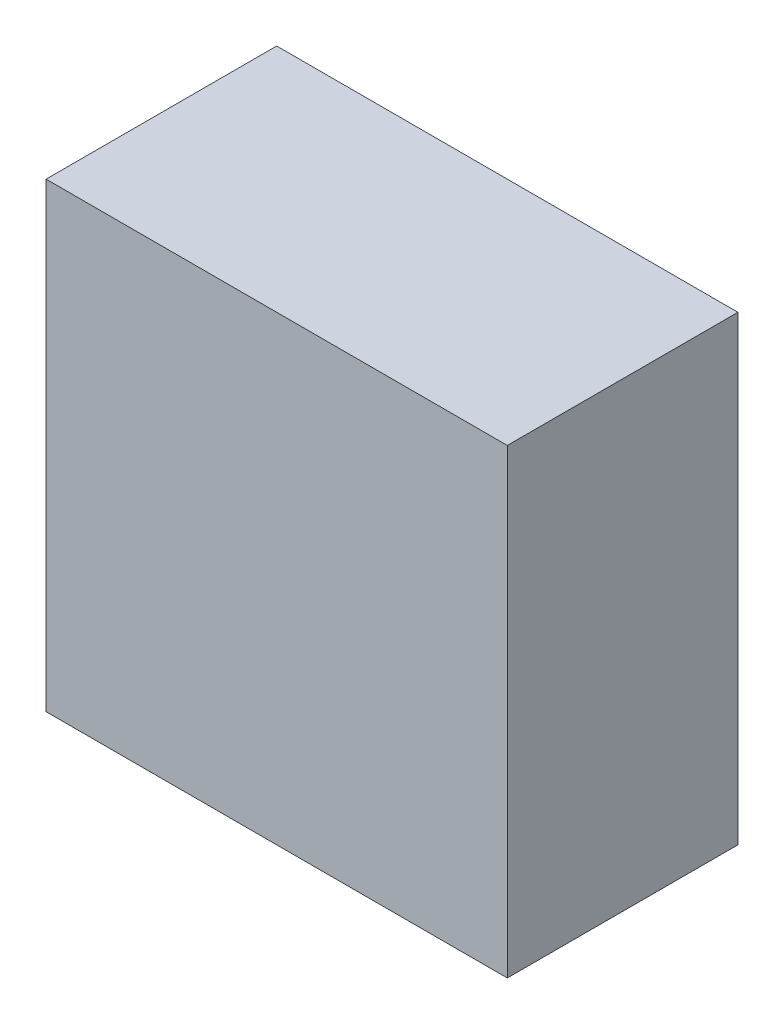
ISO-10303-21;
HEADER;
FILE_DESCRIPTION(('STEP AP214'),'2;1');
FILE_NAME('part.step','',(''),(''),'','','');
FILE_SCHEMA(('AUTOMOTIVE_DESIGN { 1 0 10303 214 1 1 1 1 }'));
ENDSEC;
DATA;
#1=APPLICATION_CONTEXT('core data for automotive mechanical design processes');
#2=APPLICATION_PROTOCOL_DEFINITION('international standard','automotive_design',2000,#1);
#3=PRODUCT_CONTEXT('',#1,'mechanical');
#4=PRODUCT('Part','Part','',(#3));
#5=PRODUCT_RELATED_PRODUCT_CATEGORY('part','',(#4));
#6=PRODUCT_DEFINITION_FORMATION('','',#4);
#7=PRODUCT_DEFINITION_CONTEXT('part definition',#1,'design');
#8=PRODUCT_DEFINITION('design','',#6,#7);
#9=PRODUCT_DEFINITION_SHAPE('','',#8);
#10=(LENGTH_UNIT() NAMED_UNIT(*) SI_UNIT(.MILLI.,.METRE.));
#11=(NAMED_UNIT(*) PLANE_ANGLE_UNIT() SI_UNIT($,.RADIAN.));
#12=(NAMED_UNIT(*) SI_UNIT($,.STERADIAN.) SOLID_ANGLE_UNIT());
#13=UNCERTAINTY_MEASURE_WITH_UNIT(LENGTH_MEASURE(1.E-05),#10,'distance_accuracy_value','');
#14=(GEOMETRIC_REPRESENTATION_CONTEXT(3) GLOBAL_UNCERTAINTY_ASSIGNED_CONTEXT((#13)) GLOBAL_UNIT_ASSIGNED_CONTEXT((#10,
#11,#12)) REPRESENTATION_CONTEXT('',''));
#15=CARTESIAN_POINT('',(0.,0.,0.));
#16=DIRECTION('',(0.,0.,1.));
#17=DIRECTION('',(1.,0.,0.));
#18=AXIS2_PLACEMENT_3D('',#15,#16,#17);
#19=CARTESIAN_POINT('',(10.,-10.,10.));
#20=DIRECTION('',(-1.,0.,0.));
#21=DIRECTION('',(0.,0.,1.));
#22=AXIS2_PLACEMENT_3D('',#19,#20,#21);
#23=PLANE('',#22);
#24=DIRECTION('',(0.,1.,0.));
#25=VECTOR('',#24,1.);
#26=CARTESIAN_POINT('',(10.,-10.,0.));
#27=LINE('',#26,#25);
#28=CARTESIAN_POINT('',(10.,-10.,0.));
#29=VERTEX_POINT('',#28);
#30=CARTESIAN_POINT('',(10.,10.,0.));
#31=VERTEX_POINT('',#30);
#32=EDGE_CURVE('E299',#29,#31,#27,.T.);
#33=ORIENTED_EDGE('',*,*,#32,.T.);
#34=DIRECTION('',(0.,0.,-1.));
#35=VECTOR('',#34,1.);
#36=CARTESIAN_POINT('',(10.,10.,10.));
#37=LINE('',#36,#35);
#38=CARTESIAN_POINT('',(10.,10.,10.));
#39=VERTEX_POINT('',#38);
#40=EDGE_CURVE('E40',#39,#31,#37,.T.);
#41=ORIENTED_EDGE('',*,*,#40,.F.);
#42=DIRECTION('',(0.,1.,0.));
#43=VECTOR('',#42,1.);
#44=CARTESIAN_POINT('',(10.,-10.,10.));
#45=LINE('',#44,#43);
#46=CARTESIAN_POINT('',(10.,-10.,10.));
#47=VERTEX_POINT('',#46);
#48=EDGE_CURVE('E305',#47,#39,#45,.T.);
#49=ORIENTED_EDGE('',*,*,#48,.F.);
#50=DIRECTION('',(0.,0.,-1.));
#51=VECTOR('',#50,1.);
#52=CARTESIAN_POINT('',(10.,-10.,10.));
#53=LINE('',#52,#51);
#54=EDGE_CURVE('E315',#47,#29,#53,.T.);
#55=ORIENTED_EDGE('',*,*,#54,.T.);
#56=EDGE_LOOP('',(#33,#41,#49,#55));
#57=FACE_BOUND('',#56,.T.);
#58=ADVANCED_FACE('F33',(#57),#23,.F.);
#59=CARTESIAN_POINT('',(-10.,10.,10.));
#60=DIRECTION('',(0.,-1.,0.));
#61=DIRECTION('',(0.,0.,-1.));
#62=AXIS2_PLACEMENT_3D('',#59,#60,#61);
#63=PLANE('',#62);
#64=DIRECTION('',(-1.,0.,0.));
#65=VECTOR('',#64,1.);
#66=CARTESIAN_POINT('',(-10.,10.,0.));
#67=LINE('',#66,#65);
#68=CARTESIAN_POINT('',(-10.,10.,0.));
#69=VERTEX_POINT('',#68);
#70=EDGE_CURVE('E318',#31,#69,#67,.T.);
#71=ORIENTED_EDGE('',*,*,#70,.T.);
#72=DIRECTION('',(0.,0.,-1.));
#73=VECTOR('',#72,1.);
#74=CARTESIAN_POINT('',(-10.,10.,10.));
#75=LINE('',#74,#73);
#76=CARTESIAN_POINT('',(-10.,10.,10.));
#77=VERTEX_POINT('',#76);
#78=EDGE_CURVE('E328',#77,#69,#75,.T.);
#79=ORIENTED_EDGE('',*,*,#78,.F.);
#80=DIRECTION('',(-1.,0.,0.));
#81=VECTOR('',#80,1.);
#82=CARTESIAN_POINT('',(-10.,10.,10.));
#83=LINE('',#82,#81);
#84=EDGE_CURVE('E308',#39,#77,#83,.T.);
#85=ORIENTED_EDGE('',*,*,#84,.F.);
#86=ORIENTED_EDGE('',*,*,#40,.T.);
#87=EDGE_LOOP('',(#71,#79,#85,#86));
#88=FACE_BOUND('',#87,.T.);
#89=ADVANCED_FACE('F333',(#88),#63,.F.);
#90=CARTESIAN_POINT('',(-10.,-10.,10.));
#91=DIRECTION('',(1.,0.,0.));
#92=DIRECTION('',(0.,0.,-1.));
#93=AXIS2_PLACEMENT_3D('',#90,#91,#92);
#94=PLANE('',#93);
#95=DIRECTION('',(0.,-1.,0.));
#96=VECTOR('',#95,1.);
#97=CARTESIAN_POINT('',(-10.,-10.,0.));
#98=LINE('',#97,#96);
#99=CARTESIAN_POINT('',(-10.,-10.,0.));
#100=VERTEX_POINT('',#99);
#101=EDGE_CURVE('E320',#69,#100,#98,.T.);
#102=ORIENTED_EDGE('',*,*,#101,.T.);
#103=DIRECTION('',(0.,0.,-1.));
#104=VECTOR('',#103,1.);
#105=CARTESIAN_POINT('',(-10.,-10.,10.));
#106=LINE('',#105,#104);
#107=CARTESIAN_POINT('',(-10.,-10.,10.));
#108=VERTEX_POINT('',#107);
#109=EDGE_CURVE('E325',#108,#100,#106,.T.);
#110=ORIENTED_EDGE('',*,*,#109,.F.);
#111=DIRECTION('',(0.,-1.,0.));
#112=VECTOR('',#111,1.);
#113=CARTESIAN_POINT('',(-10.,-10.,10.));
#114=LINE('',#113,#112);
#115=EDGE_CURVE('E311',#77,#108,#114,.T.);
#116=ORIENTED_EDGE('',*,*,#115,.F.);
#117=ORIENTED_EDGE('',*,*,#78,.T.);
#118=EDGE_LOOP('',(#102,#110,#116,#117));
#119=FACE_BOUND('',#118,.T.);
#120=ADVANCED_FACE('F345',(#119),#94,.F.);
#121=CARTESIAN_POINT('',(-10.,-10.,10.));
#122=DIRECTION('',(0.,1.,0.));
#123=DIRECTION('',(0.,0.,1.));
#124=AXIS2_PLACEMENT_3D('',#121,#122,#123);
#125=PLANE('',#124);
#126=DIRECTION('',(1.,0.,0.));
#127=VECTOR('',#126,1.);
#128=CARTESIAN_POINT('',(-10.,-10.,0.));
#129=LINE('',#128,#127);
#130=EDGE_CURVE('E309',#100,#29,#129,.T.);
#131=ORIENTED_EDGE('',*,*,#130,.T.);
#132=ORIENTED_EDGE('',*,*,#54,.F.);
#133=DIRECTION('',(1.,0.,0.));
#134=VECTOR('',#133,1.);
#135=CARTESIAN_POINT('',(-10.,-10.,10.));
#136=LINE('',#135,#134);
#137=EDGE_CURVE('E313',#108,#47,#136,.T.);
#138=ORIENTED_EDGE('',*,*,#137,.F.);
#139=ORIENTED_EDGE('',*,*,#109,.T.);
#140=EDGE_LOOP('',(#131,#132,#138,#139));
#141=FACE_BOUND('',#140,.T.);
#142=ADVANCED_FACE('F349',(#141),#125,.F.);
#143=CARTESIAN_POINT('',(0.,0.,10.));
#144=DIRECTION('',(0.,0.,-1.));
#145=DIRECTION('',(-1.,0.,0.));
#146=AXIS2_PLACEMENT_3D('',#143,#144,#145);
#147=PLANE('',#146);
#148=ORIENTED_EDGE('',*,*,#48,.T.);
#149=ORIENTED_EDGE('',*,*,#84,.T.);
#150=ORIENTED_EDGE('',*,*,#115,.T.);
#151=ORIENTED_EDGE('',*,*,#137,.T.);
#152=EDGE_LOOP('',(#148,#149,#150,#151));
#153=FACE_BOUND('',#152,.T.);
#154=ADVANCED_FACE('F351',(#153),#147,.F.);
#155=CARTESIAN_POINT('',(0.,0.,0.));
#156=DIRECTION('',(0.,0.,-1.));
#157=DIRECTION('',(-1.,0.,0.));
#158=AXIS2_PLACEMENT_3D('',#155,#156,#157);
#159=PLANE('',#158);
#160=DIRECTION('',(0.,1.,0.));
#161=VECTOR('',#160,1.);
#162=CARTESIAN_POINT('',(-8.5,-8.5,0.));
#163=LINE('',#162,#161);
#164=CARTESIAN_POINT('',(-8.5,-8.5,0.));
#165=VERTEX_POINT('',#164);
#166=CARTESIAN_POINT('',(-8.5,8.5,0.));
#167=VERTEX_POINT('',#166);
#168=EDGE_CURVE('E55',#165,#167,#163,.T.);
#169=ORIENTED_EDGE('',*,*,#168,.F.);
#170=DIRECTION('',(-1.,0.,0.));
#171=VECTOR('',#170,1.);
#172=CARTESIAN_POINT('',(8.5,-8.5,0.));
#173=LINE('',#172,#171);
#174=CARTESIAN_POINT('',(8.5,-8.5,0.));
#175=VERTEX_POINT('',#174);
#176=EDGE_CURVE('E278',#175,#165,#173,.T.);
#177=ORIENTED_EDGE('',*,*,#176,.F.);
#178=DIRECTION('',(0.,-1.,0.));
#179=VECTOR('',#178,1.);
#180=CARTESIAN_POINT('',(8.5,-8.5,0.));
#181=LINE('',#180,#179);
#182=CARTESIAN_POINT('',(8.5,8.5,0.));
#183=VERTEX_POINT('',#182);
#184=EDGE_CURVE('E292',#183,#175,#181,.T.);
#185=ORIENTED_EDGE('',*,*,#184,.F.);
#186=DIRECTION('',(1.,0.,0.));
#187=VECTOR('',#186,1.);
#188=CARTESIAN_POINT('',(8.5,8.5,0.));
#189=LINE('',#188,#187);
#190=EDGE_CURVE('E289',#167,#183,#189,.T.);
#191=ORIENTED_EDGE('',*,*,#190,.F.);
#192=EDGE_LOOP('',(#169,#177,#185,#191));
#193=FACE_BOUND('',#192,.T.);
#194=ORIENTED_EDGE('',*,*,#32,.F.);
#195=ORIENTED_EDGE('',*,*,#130,.F.);
#196=ORIENTED_EDGE('',*,*,#101,.F.);
#197=ORIENTED_EDGE('',*,*,#70,.F.);
#198=EDGE_LOOP('',(#194,#195,#196,#197));
#199=FACE_BOUND('',#198,.T.);
#200=ADVANCED_FACE('F341',(#193,#199),#159,.T.);
#201=CARTESIAN_POINT('',(-8.5,-8.5,7.5));
#202=DIRECTION('',(-1.,0.,0.));
#203=DIRECTION('',(0.,0.,1.));
#204=AXIS2_PLACEMENT_3D('',#201,#202,#203);
#205=PLANE('',#204);
#206=ORIENTED_EDGE('',*,*,#168,.T.);
#207=DIRECTION('',(0.,0.,-1.));
#208=VECTOR('',#207,1.);
#209=CARTESIAN_POINT('',(-8.5,8.5,7.5));
#210=LINE('',#209,#208);
#211=CARTESIAN_POINT('',(-8.5,8.5,7.5));
#212=VERTEX_POINT('',#211);
#213=EDGE_CURVE('E287',#212,#167,#210,.T.);
#214=ORIENTED_EDGE('',*,*,#213,.F.);
#215=DIRECTION('',(0.,1.,0.));
#216=VECTOR('',#215,1.);
#217=CARTESIAN_POINT('',(-8.5,-8.5,7.5));
#218=LINE('',#217,#216);
#219=CARTESIAN_POINT('',(-8.5,-8.5,7.5));
#220=VERTEX_POINT('',#219);
#221=EDGE_CURVE('E274',#220,#212,#218,.T.);
#222=ORIENTED_EDGE('',*,*,#221,.F.);
#223=DIRECTION('',(0.,0.,-1.));
#224=VECTOR('',#223,1.);
#225=CARTESIAN_POINT('',(-8.5,-8.5,7.5));
#226=LINE('',#225,#224);
#227=EDGE_CURVE('E297',#220,#165,#226,.T.);
#228=ORIENTED_EDGE('',*,*,#227,.T.);
#229=EDGE_LOOP('',(#206,#214,#222,#228));
#230=FACE_BOUND('',#229,.T.);
#231=ADVANCED_FACE('F358',(#230),#205,.F.);
#232=CARTESIAN_POINT('',(8.5,-8.5,7.5));
#233=DIRECTION('',(0.,-1.,0.));
#234=DIRECTION('',(0.,0.,-1.));
#235=AXIS2_PLACEMENT_3D('',#232,#233,#234);
#236=PLANE('',#235);
#237=ORIENTED_EDGE('',*,*,#176,.T.);
#238=ORIENTED_EDGE('',*,*,#227,.F.);
#239=DIRECTION('',(-1.,0.,0.));
#240=VECTOR('',#239,1.);
#241=CARTESIAN_POINT('',(8.5,-8.5,7.5));
#242=LINE('',#241,#240);
#243=CARTESIAN_POINT('',(8.5,-8.5,7.5));
#244=VERTEX_POINT('',#243);
#245=EDGE_CURVE('E284',#244,#220,#242,.T.);
#246=ORIENTED_EDGE('',*,*,#245,.F.);
#247=DIRECTION('',(0.,0.,-1.));
#248=VECTOR('',#247,1.);
#249=CARTESIAN_POINT('',(8.5,-8.5,7.5));
#250=LINE('',#249,#248);
#251=EDGE_CURVE('E300',#244,#175,#250,.T.);
#252=ORIENTED_EDGE('',*,*,#251,.T.);
#253=EDGE_LOOP('',(#237,#238,#246,#252));
#254=FACE_BOUND('',#253,.T.);
#255=ADVANCED_FACE('F396',(#254),#236,.F.);
#256=CARTESIAN_POINT('',(8.5,-8.5,7.5));
#257=DIRECTION('',(1.,0.,0.));
#258=DIRECTION('',(0.,0.,-1.));
#259=AXIS2_PLACEMENT_3D('',#256,#257,#258);
#260=PLANE('',#259);
#261=ORIENTED_EDGE('',*,*,#184,.T.);
#262=ORIENTED_EDGE('',*,*,#251,.F.);
#263=DIRECTION('',(0.,-1.,0.));
#264=VECTOR('',#263,1.);
#265=CARTESIAN_POINT('',(8.5,-8.5,7.5));
#266=LINE('',#265,#264);
#267=CARTESIAN_POINT('',(8.5,8.5,7.5));
#268=VERTEX_POINT('',#267);
#269=EDGE_CURVE('E281',#268,#244,#266,.T.);
#270=ORIENTED_EDGE('',*,*,#269,.F.);
#271=DIRECTION('',(0.,0.,-1.));
#272=VECTOR('',#271,1.);
#273=CARTESIAN_POINT('',(8.5,8.5,7.5));
#274=LINE('',#273,#272);
#275=EDGE_CURVE('E302',#268,#183,#274,.T.);
#276=ORIENTED_EDGE('',*,*,#275,.T.);
#277=EDGE_LOOP('',(#261,#262,#270,#276));
#278=FACE_BOUND('',#277,.T.);
#279=ADVANCED_FACE('F404',(#278),#260,.F.);
#280=CARTESIAN_POINT('',(8.5,8.5,7.5));
#281=DIRECTION('',(0.,1.,0.));
#282=DIRECTION('',(0.,0.,1.));
#283=AXIS2_PLACEMENT_3D('',#280,#281,#282);
#284=PLANE('',#283);
#285=ORIENTED_EDGE('',*,*,#190,.T.);
#286=ORIENTED_EDGE('',*,*,#275,.F.);
#287=DIRECTION('',(1.,0.,0.));
#288=VECTOR('',#287,1.);
#289=CARTESIAN_POINT('',(8.5,8.5,7.5));
#290=LINE('',#289,#288);
#291=EDGE_CURVE('E277',#212,#268,#290,.T.);
#292=ORIENTED_EDGE('',*,*,#291,.F.);
#293=ORIENTED_EDGE('',*,*,#213,.T.);
#294=EDGE_LOOP('',(#285,#286,#292,#293));
#295=FACE_BOUND('',#294,.T.);
#296=ADVANCED_FACE('F414',(#295),#284,.F.);
#297=CARTESIAN_POINT('',(0.,0.,7.5));
#298=DIRECTION('',(0.,0.,1.));
#299=DIRECTION('',(1.,0.,0.));
#300=AXIS2_PLACEMENT_3D('',#297,#298,#299);
#301=PLANE('',#300);
#302=CARTESIAN_POINT('',(0.,0.,7.5));
#303=DIRECTION('',(0.,0.,1.));
#304=DIRECTION('',(1.,0.,0.));
#305=AXIS2_PLACEMENT_3D('',#302,#303,#304);
#306=CIRCLE('',#305,2.65);
#307=CARTESIAN_POINT('',(2.65,0.,7.5));
#308=VERTEX_POINT('',#307);
#309=EDGE_CURVE('E11',#308,#308,#306,.F.);
#310=ORIENTED_EDGE('',*,*,#309,.F.);
#311=EDGE_LOOP('',(#310));
#312=FACE_BOUND('',#311,.T.);
#313=ORIENTED_EDGE('',*,*,#221,.T.);
#314=ORIENTED_EDGE('',*,*,#291,.T.);
#315=ORIENTED_EDGE('',*,*,#269,.T.);
#316=ORIENTED_EDGE('',*,*,#245,.T.);
#317=EDGE_LOOP('',(#313,#314,#315,#316));
#318=FACE_BOUND('',#317,.T.);
#319=ADVANCED_FACE('F424',(#312,#318),#301,.F.);
#320=CARTESIAN_POINT('',(0.,0.,0.));
#321=DIRECTION('',(0.,0.,1.));
#322=DIRECTION('',(1.,0.,0.));
#323=AXIS2_PLACEMENT_3D('',#320,#321,#322);
#324=CYLINDRICAL_SURFACE('',#323,2.65);
#325=CARTESIAN_POINT('',(0.,0.,0.));
#326=DIRECTION('',(0.,0.,-1.));
#327=DIRECTION('',(-1.,0.,0.));
#328=AXIS2_PLACEMENT_3D('',#325,#326,#327);
#329=CIRCLE('',#328,2.65);
#330=CARTESIAN_POINT('',(-2.65,0.,0.));
#331=VERTEX_POINT('',#330);
#332=EDGE_CURVE('E252',#331,#331,#329,.T.);
#333=ORIENTED_EDGE('',*,*,#332,.F.);
#334=EDGE_LOOP('',(#333));
#335=FACE_BOUND('',#334,.T.);
#336=ORIENTED_EDGE('',*,*,#309,.T.);
#337=EDGE_LOOP('',(#336));
#338=FACE_BOUND('',#337,.T.);
#339=ADVANCED_FACE('F434',(#335,#338),#324,.T.);
#340=CARTESIAN_POINT('',(0.,0.,0.));
#341=DIRECTION('',(0.,0.,-1.));
#342=DIRECTION('',(-1.,0.,0.));
#343=AXIS2_PLACEMENT_3D('',#340,#341,#342);
#344=PLANE('',#343);
#345=DIRECTION('',(-1.,0.,0.));
#346=VECTOR('',#345,1.);
#347=CARTESIAN_POINT('',(-0.65,-0.65,0.));
#348=LINE('',#347,#346);
#349=CARTESIAN_POINT('',(-0.65,-0.65,0.));
#350=VERTEX_POINT('',#349);
#351=CARTESIAN_POINT('',(-2.15,-0.65,0.));
#352=VERTEX_POINT('',#351);
#353=EDGE_CURVE('E47',#350,#352,#348,.T.);
#354=ORIENTED_EDGE('',*,*,#353,.F.);
#355=DIRECTION('',(0.,1.,0.));
#356=VECTOR('',#355,1.);
#357=CARTESIAN_POINT('',(-0.65,-2.15,0.));
#358=LINE('',#357,#356);
#359=CARTESIAN_POINT('',(-0.65,-2.15,0.));
#360=VERTEX_POINT('',#359);
#361=EDGE_CURVE('E190',#360,#350,#358,.T.);
#362=ORIENTED_EDGE('',*,*,#361,.F.);
#363=DIRECTION('',(-1.,0.,0.));
#364=VECTOR('',#363,1.);
#365=CARTESIAN_POINT('',(0.65,-2.15,0.));
#366=LINE('',#365,#364);
#367=CARTESIAN_POINT('',(0.65,-2.15,0.));
#368=VERTEX_POINT('',#367);
#369=EDGE_CURVE('E193',#368,#360,#366,.T.);
#370=ORIENTED_EDGE('',*,*,#369,.F.);
#371=DIRECTION('',(0.,-1.,0.));
#372=VECTOR('',#371,1.);
#373=CARTESIAN_POINT('',(0.65,-2.15,0.));
#374=LINE('',#373,#372);
#375=CARTESIAN_POINT('',(0.65,-0.65,0.));
#376=VERTEX_POINT('',#375);
#377=EDGE_CURVE('E245',#376,#368,#374,.T.);
#378=ORIENTED_EDGE('',*,*,#377,.F.);
#379=DIRECTION('',(-1.,0.,0.));
#380=VECTOR('',#379,1.);
#381=CARTESIAN_POINT('',(0.65,-0.65,0.));
#382=LINE('',#381,#380);
#383=CARTESIAN_POINT('',(2.15,-0.65,0.));
#384=VERTEX_POINT('',#383);
#385=EDGE_CURVE('E242',#384,#376,#382,.T.);
#386=ORIENTED_EDGE('',*,*,#385,.F.);
#387=DIRECTION('',(0.,-1.,0.));
#388=VECTOR('',#387,1.);
#389=CARTESIAN_POINT('',(2.15,0.65,0.));
#390=LINE('',#389,#388);
#391=CARTESIAN_POINT('',(2.15,0.65,0.));
#392=VERTEX_POINT('',#391);
#393=EDGE_CURVE('E239',#392,#384,#390,.T.);
#394=ORIENTED_EDGE('',*,*,#393,.F.);
#395=DIRECTION('',(1.,0.,0.));
#396=VECTOR('',#395,1.);
#397=CARTESIAN_POINT('',(0.65,0.65,0.));
#398=LINE('',#397,#396);
#399=CARTESIAN_POINT('',(0.65,0.65,0.));
#400=VERTEX_POINT('',#399);
#401=EDGE_CURVE('E236',#400,#392,#398,.T.);
#402=ORIENTED_EDGE('',*,*,#401,.F.);
#403=DIRECTION('',(0.,-1.,0.));
#404=VECTOR('',#403,1.);
#405=CARTESIAN_POINT('',(0.65,2.15,0.));
#406=LINE('',#405,#404);
#407=CARTESIAN_POINT('',(0.65,2.15,0.));
#408=VERTEX_POINT('',#407);
#409=EDGE_CURVE('E233',#408,#400,#406,.T.);
#410=ORIENTED_EDGE('',*,*,#409,.F.);
#411=DIRECTION('',(1.,0.,0.));
#412=VECTOR('',#411,1.);
#413=CARTESIAN_POINT('',(0.65,2.15,0.));
#414=LINE('',#413,#412);
#415=CARTESIAN_POINT('',(-0.65,2.15,0.));
#416=VERTEX_POINT('',#415);
#417=EDGE_CURVE('E230',#416,#408,#414,.T.);
#418=ORIENTED_EDGE('',*,*,#417,.F.);
#419=DIRECTION('',(0.,1.,0.));
#420=VECTOR('',#419,1.);
#421=CARTESIAN_POINT('',(-0.65,2.15,0.));
#422=LINE('',#421,#420);
#423=CARTESIAN_POINT('',(-0.65,0.65,0.));
#424=VERTEX_POINT('',#423);
#425=EDGE_CURVE('E227',#424,#416,#422,.T.);
#426=ORIENTED_EDGE('',*,*,#425,.F.);
#427=DIRECTION('',(1.,0.,0.));
#428=VECTOR('',#427,1.);
#429=CARTESIAN_POINT('',(-0.65,0.65,0.));
#430=LINE('',#429,#428);
#431=CARTESIAN_POINT('',(-2.15,0.65,0.));
#432=VERTEX_POINT('',#431);
#433=EDGE_CURVE('E224',#432,#424,#430,.T.);
#434=ORIENTED_EDGE('',*,*,#433,.F.);
#435=DIRECTION('',(0.,1.,0.));
#436=VECTOR('',#435,1.);
#437=CARTESIAN_POINT('',(-2.15,0.65,0.));
#438=LINE('',#437,#436);
#439=EDGE_CURVE('E222',#352,#432,#438,.T.);
#440=ORIENTED_EDGE('',*,*,#439,.F.);
#441=EDGE_LOOP('',(#354,#362,#370,#378,#386,#394,#402,#410,#418,#426,#434,#440));
#442=FACE_BOUND('',#441,.T.);
#443=ORIENTED_EDGE('',*,*,#332,.T.);
#444=EDGE_LOOP('',(#443));
#445=FACE_BOUND('',#444,.T.);
#446=ADVANCED_FACE('F444',(#442,#445),#344,.T.);
#447=CARTESIAN_POINT('',(-0.65,-0.65,7.5));
#448=DIRECTION('',(0.,-1.,0.));
#449=DIRECTION('',(0.,0.,-1.));
#450=AXIS2_PLACEMENT_3D('',#447,#448,#449);
#451=PLANE('',#450);
#452=ORIENTED_EDGE('',*,*,#353,.T.);
#453=DIRECTION('',(0.,0.,-1.));
#454=VECTOR('',#453,1.);
#455=CARTESIAN_POINT('',(-2.15,-0.65,7.5));
#456=LINE('',#455,#454);
#457=CARTESIAN_POINT('',(-2.15,-0.65,7.5));
#458=VERTEX_POINT('',#457);
#459=EDGE_CURVE('E167',#458,#352,#456,.T.);
#460=ORIENTED_EDGE('',*,*,#459,.F.);
#461=DIRECTION('',(-1.,0.,0.));
#462=VECTOR('',#461,1.);
#463=CARTESIAN_POINT('',(-0.65,-0.65,7.5));
#464=LINE('',#463,#462);
#465=CARTESIAN_POINT('',(-0.65,-0.65,7.5));
#466=VERTEX_POINT('',#465);
#467=EDGE_CURVE('E171',#466,#458,#464,.T.);
#468=ORIENTED_EDGE('',*,*,#467,.F.);
#469=DIRECTION('',(0.,0.,-1.));
#470=VECTOR('',#469,1.);
#471=CARTESIAN_POINT('',(-0.65,-0.65,7.5));
#472=LINE('',#471,#470);
#473=EDGE_CURVE('E250',#466,#350,#472,.T.);
#474=ORIENTED_EDGE('',*,*,#473,.T.);
#475=EDGE_LOOP('',(#452,#460,#468,#474));
#476=FACE_BOUND('',#475,.T.);
#477=ADVANCED_FACE('F169',(#476),#451,.F.);
#478=CARTESIAN_POINT('',(-0.65,-2.15,7.5));
#479=DIRECTION('',(-1.,0.,0.));
#480=DIRECTION('',(0.,-1.,0.));
#481=AXIS2_PLACEMENT_3D('',#478,#479,#480);
#482=PLANE('',#481);
#483=ORIENTED_EDGE('',*,*,#361,.T.);
#484=ORIENTED_EDGE('',*,*,#473,.F.);
#485=DIRECTION('',(0.,1.,0.));
#486=VECTOR('',#485,1.);
#487=CARTESIAN_POINT('',(-0.65,-2.15,7.5));
#488=LINE('',#487,#486);
#489=CARTESIAN_POINT('',(-0.65,-2.15,7.5));
#490=VERTEX_POINT('',#489);
#491=EDGE_CURVE('E177',#490,#466,#488,.T.);
#492=ORIENTED_EDGE('',*,*,#491,.F.);
#493=DIRECTION('',(0.,0.,-1.));
#494=VECTOR('',#493,1.);
#495=CARTESIAN_POINT('',(-0.65,-2.15,7.5));
#496=LINE('',#495,#494);
#497=EDGE_CURVE('E253',#490,#360,#496,.T.);
#498=ORIENTED_EDGE('',*,*,#497,.T.);
#499=EDGE_LOOP('',(#483,#484,#492,#498));
#500=FACE_BOUND('',#499,.T.);
#501=ADVANCED_FACE('F463',(#500),#482,.F.);
#502=CARTESIAN_POINT('',(0.65,-2.15,7.5));
#503=DIRECTION('',(0.,-1.,0.));
#504=DIRECTION('',(0.,0.,-1.));
#505=AXIS2_PLACEMENT_3D('',#502,#503,#504);
#506=PLANE('',#505);
#507=ORIENTED_EDGE('',*,*,#369,.T.);
#508=ORIENTED_EDGE('',*,*,#497,.F.);
#509=DIRECTION('',(-1.,0.,0.));
#510=VECTOR('',#509,1.);
#511=CARTESIAN_POINT('',(0.65,-2.15,7.5));
#512=LINE('',#511,#510);
#513=CARTESIAN_POINT('',(0.65,-2.15,7.5));
#514=VERTEX_POINT('',#513);
#515=EDGE_CURVE('E218',#514,#490,#512,.T.);
#516=ORIENTED_EDGE('',*,*,#515,.F.);
#517=DIRECTION('',(0.,0.,-1.));
#518=VECTOR('',#517,1.);
#519=CARTESIAN_POINT('',(0.65,-2.15,7.5));
#520=LINE('',#519,#518);
#521=EDGE_CURVE('E255',#514,#368,#520,.T.);
#522=ORIENTED_EDGE('',*,*,#521,.T.);
#523=EDGE_LOOP('',(#507,#508,#516,#522));
#524=FACE_BOUND('',#523,.T.);
#525=ADVANCED_FACE('F472',(#524),#506,.F.);
#526=CARTESIAN_POINT('',(0.65,-2.15,7.5));
#527=DIRECTION('',(1.,0.,0.));
#528=DIRECTION('',(0.,1.,0.));
#529=AXIS2_PLACEMENT_3D('',#526,#527,#528);
#530=PLANE('',#529);
#531=ORIENTED_EDGE('',*,*,#377,.T.);
#532=ORIENTED_EDGE('',*,*,#521,.F.);
#533=DIRECTION('',(0.,-1.,0.));
#534=VECTOR('',#533,1.);
#535=CARTESIAN_POINT('',(0.65,-2.15,7.5));
#536=LINE('',#535,#534);
#537=CARTESIAN_POINT('',(0.65,-0.65,7.5));
#538=VERTEX_POINT('',#537);
#539=EDGE_CURVE('E215',#538,#514,#536,.T.);
#540=ORIENTED_EDGE('',*,*,#539,.F.);
#541=DIRECTION('',(0.,0.,-1.));
#542=VECTOR('',#541,1.);
#543=CARTESIAN_POINT('',(0.65,-0.65,7.5));
#544=LINE('',#543,#542);
#545=EDGE_CURVE('E257',#538,#376,#544,.T.);
#546=ORIENTED_EDGE('',*,*,#545,.T.);
#547=EDGE_LOOP('',(#531,#532,#540,#546));
#548=FACE_BOUND('',#547,.T.);
#549=ADVANCED_FACE('F482',(#548),#530,.F.);
#550=CARTESIAN_POINT('',(0.65,-0.65,7.5));
#551=DIRECTION('',(0.,-1.,0.));
#552=DIRECTION('',(0.,0.,-1.));
#553=AXIS2_PLACEMENT_3D('',#550,#551,#552);
#554=PLANE('',#553);
#555=ORIENTED_EDGE('',*,*,#385,.T.);
#556=ORIENTED_EDGE('',*,*,#545,.F.);
#557=DIRECTION('',(-1.,0.,0.));
#558=VECTOR('',#557,1.);
#559=CARTESIAN_POINT('',(0.65,-0.65,7.5));
#560=LINE('',#559,#558);
#561=CARTESIAN_POINT('',(2.15,-0.65,7.5));
#562=VERTEX_POINT('',#561);
#563=EDGE_CURVE('E212',#562,#538,#560,.T.);
#564=ORIENTED_EDGE('',*,*,#563,.F.);
#565=DIRECTION('',(0.,0.,-1.));
#566=VECTOR('',#565,1.);
#567=CARTESIAN_POINT('',(2.15,-0.65,7.5));
#568=LINE('',#567,#566);
#569=EDGE_CURVE('E259',#562,#384,#568,.T.);
#570=ORIENTED_EDGE('',*,*,#569,.T.);
#571=EDGE_LOOP('',(#555,#556,#564,#570));
#572=FACE_BOUND('',#571,.T.);
#573=ADVANCED_FACE('F492',(#572),#554,.F.);
#574=CARTESIAN_POINT('',(2.15,0.65,7.5));
#575=DIRECTION('',(1.,0.,0.));
#576=DIRECTION('',(0.,0.,-1.));
#577=AXIS2_PLACEMENT_3D('',#574,#575,#576);
#578=PLANE('',#577);
#579=ORIENTED_EDGE('',*,*,#393,.T.);
#580=ORIENTED_EDGE('',*,*,#569,.F.);
#581=DIRECTION('',(0.,-1.,0.));
#582=VECTOR('',#581,1.);
#583=CARTESIAN_POINT('',(2.15,0.65,7.5));
#584=LINE('',#583,#582);
#585=CARTESIAN_POINT('',(2.15,0.65,7.5));
#586=VERTEX_POINT('',#585);
#587=EDGE_CURVE('E209',#586,#562,#584,.T.);
#588=ORIENTED_EDGE('',*,*,#587,.F.);
#589=DIRECTION('',(0.,0.,-1.));
#590=VECTOR('',#589,1.);
#591=CARTESIAN_POINT('',(2.15,0.65,7.5));
#592=LINE('',#591,#590);
#593=EDGE_CURVE('E261',#586,#392,#592,.T.);
#594=ORIENTED_EDGE('',*,*,#593,.T.);
#595=EDGE_LOOP('',(#579,#580,#588,#594));
#596=FACE_BOUND('',#595,.T.);
#597=ADVANCED_FACE('F502',(#596),#578,.F.);
#598=CARTESIAN_POINT('',(0.65,0.65,7.5));
#599=DIRECTION('',(0.,1.,0.));
#600=DIRECTION('',(0.,0.,1.));
#601=AXIS2_PLACEMENT_3D('',#598,#599,#600);
#602=PLANE('',#601);
#603=ORIENTED_EDGE('',*,*,#401,.T.);
#604=ORIENTED_EDGE('',*,*,#593,.F.);
#605=DIRECTION('',(1.,0.,0.));
#606=VECTOR('',#605,1.);
#607=CARTESIAN_POINT('',(0.65,0.65,7.5));
#608=LINE('',#607,#606);
#609=CARTESIAN_POINT('',(0.65,0.65,7.5));
#610=VERTEX_POINT('',#609);
#611=EDGE_CURVE('E206',#610,#586,#608,.T.);
#612=ORIENTED_EDGE('',*,*,#611,.F.);
#613=DIRECTION('',(0.,0.,-1.));
#614=VECTOR('',#613,1.);
#615=CARTESIAN_POINT('',(0.65,0.65,7.5));
#616=LINE('',#615,#614);
#617=EDGE_CURVE('E263',#610,#400,#616,.T.);
#618=ORIENTED_EDGE('',*,*,#617,.T.);
#619=EDGE_LOOP('',(#603,#604,#612,#618));
#620=FACE_BOUND('',#619,.T.);
#621=ADVANCED_FACE('F512',(#620),#602,.F.);
#622=CARTESIAN_POINT('',(0.65,2.15,7.5));
#623=DIRECTION('',(1.,0.,0.));
#624=DIRECTION('',(0.,1.,0.));
#625=AXIS2_PLACEMENT_3D('',#622,#623,#624);
#626=PLANE('',#625);
#627=ORIENTED_EDGE('',*,*,#409,.T.);
#628=ORIENTED_EDGE('',*,*,#617,.F.);
#629=DIRECTION('',(0.,-1.,0.));
#630=VECTOR('',#629,1.);
#631=CARTESIAN_POINT('',(0.65,2.15,7.5));
#632=LINE('',#631,#630);
#633=CARTESIAN_POINT('',(0.65,2.15,7.5));
#634=VERTEX_POINT('',#633);
#635=EDGE_CURVE('E203',#634,#610,#632,.T.);
#636=ORIENTED_EDGE('',*,*,#635,.F.);
#637=DIRECTION('',(0.,0.,-1.));
#638=VECTOR('',#637,1.);
#639=CARTESIAN_POINT('',(0.65,2.15,7.5));
#640=LINE('',#639,#638);
#641=EDGE_CURVE('E265',#634,#408,#640,.T.);
#642=ORIENTED_EDGE('',*,*,#641,.T.);
#643=EDGE_LOOP('',(#627,#628,#636,#642));
#644=FACE_BOUND('',#643,.T.);
#645=ADVANCED_FACE('F522',(#644),#626,.F.);
#646=CARTESIAN_POINT('',(0.65,2.15,7.5));
#647=DIRECTION('',(0.,1.,0.));
#648=DIRECTION('',(0.,0.,1.));
#649=AXIS2_PLACEMENT_3D('',#646,#647,#648);
#650=PLANE('',#649);
#651=ORIENTED_EDGE('',*,*,#417,.T.);
#652=ORIENTED_EDGE('',*,*,#641,.F.);
#653=DIRECTION('',(1.,0.,0.));
#654=VECTOR('',#653,1.);
#655=CARTESIAN_POINT('',(0.65,2.15,7.5));
#656=LINE('',#655,#654);
#657=CARTESIAN_POINT('',(-0.65,2.15,7.5));
#658=VERTEX_POINT('',#657);
#659=EDGE_CURVE('E200',#658,#634,#656,.T.);
#660=ORIENTED_EDGE('',*,*,#659,.F.);
#661=DIRECTION('',(0.,0.,-1.));
#662=VECTOR('',#661,1.);
#663=CARTESIAN_POINT('',(-0.65,2.15,7.5));
#664=LINE('',#663,#662);
#665=EDGE_CURVE('E267',#658,#416,#664,.T.);
#666=ORIENTED_EDGE('',*,*,#665,.T.);
#667=EDGE_LOOP('',(#651,#652,#660,#666));
#668=FACE_BOUND('',#667,.T.);
#669=ADVANCED_FACE('F532',(#668),#650,.F.);
#670=CARTESIAN_POINT('',(-0.65,2.15,7.5));
#671=DIRECTION('',(-1.,0.,0.));
#672=DIRECTION('',(0.,-1.,0.));
#673=AXIS2_PLACEMENT_3D('',#670,#671,#672);
#674=PLANE('',#673);
#675=ORIENTED_EDGE('',*,*,#425,.T.);
#676=ORIENTED_EDGE('',*,*,#665,.F.);
#677=DIRECTION('',(0.,1.,0.));
#678=VECTOR('',#677,1.);
#679=CARTESIAN_POINT('',(-0.65,2.15,7.5));
#680=LINE('',#679,#678);
#681=CARTESIAN_POINT('',(-0.65,0.65,7.5));
#682=VERTEX_POINT('',#681);
#683=EDGE_CURVE('E197',#682,#658,#680,.T.);
#684=ORIENTED_EDGE('',*,*,#683,.F.);
#685=DIRECTION('',(0.,0.,-1.));
#686=VECTOR('',#685,1.);
#687=CARTESIAN_POINT('',(-0.65,0.65,7.5));
#688=LINE('',#687,#686);
#689=EDGE_CURVE('E269',#682,#424,#688,.T.);
#690=ORIENTED_EDGE('',*,*,#689,.T.);
#691=EDGE_LOOP('',(#675,#676,#684,#690));
#692=FACE_BOUND('',#691,.T.);
#693=ADVANCED_FACE('F542',(#692),#674,.F.);
#694=CARTESIAN_POINT('',(-0.65,0.65,7.5));
#695=DIRECTION('',(0.,1.,0.));
#696=DIRECTION('',(0.,0.,1.));
#697=AXIS2_PLACEMENT_3D('',#694,#695,#696);
#698=PLANE('',#697);
#699=ORIENTED_EDGE('',*,*,#433,.T.);
#700=ORIENTED_EDGE('',*,*,#689,.F.);
#701=DIRECTION('',(1.,0.,0.));
#702=VECTOR('',#701,1.);
#703=CARTESIAN_POINT('',(-0.65,0.65,7.5));
#704=LINE('',#703,#702);
#705=CARTESIAN_POINT('',(-2.15,0.65,7.5));
#706=VERTEX_POINT('',#705);
#707=EDGE_CURVE('E185',#706,#682,#704,.T.);
#708=ORIENTED_EDGE('',*,*,#707,.F.);
#709=DIRECTION('',(0.,0.,-1.));
#710=VECTOR('',#709,1.);
#711=CARTESIAN_POINT('',(-2.15,0.65,7.5));
#712=LINE('',#711,#710);
#713=EDGE_CURVE('E176',#706,#432,#712,.T.);
#714=ORIENTED_EDGE('',*,*,#713,.T.);
#715=EDGE_LOOP('',(#699,#700,#708,#714));
#716=FACE_BOUND('',#715,.T.);
#717=ADVANCED_FACE('F552',(#716),#698,.F.);
#718=CARTESIAN_POINT('',(-2.15,0.65,7.5));
#719=DIRECTION('',(-1.,0.,0.));
#720=DIRECTION('',(0.,0.,1.));
#721=AXIS2_PLACEMENT_3D('',#718,#719,#720);
#722=PLANE('',#721);
#723=ORIENTED_EDGE('',*,*,#439,.T.);
#724=ORIENTED_EDGE('',*,*,#713,.F.);
#725=DIRECTION('',(0.,1.,0.));
#726=VECTOR('',#725,1.);
#727=CARTESIAN_POINT('',(-2.15,0.65,7.5));
#728=LINE('',#727,#726);
#729=EDGE_CURVE('E180',#458,#706,#728,.T.);
#730=ORIENTED_EDGE('',*,*,#729,.F.);
#731=ORIENTED_EDGE('',*,*,#459,.T.);
#732=EDGE_LOOP('',(#723,#724,#730,#731));
#733=FACE_BOUND('',#732,.T.);
#734=ADVANCED_FACE('F181',(#733),#722,.F.);
#735=CARTESIAN_POINT('',(0.,0.,7.5));
#736=DIRECTION('',(0.,0.,1.));
#737=DIRECTION('',(1.,0.,0.));
#738=AXIS2_PLACEMENT_3D('',#735,#736,#737);
#739=PLANE('',#738);
#740=ORIENTED_EDGE('',*,*,#467,.T.);
#741=ORIENTED_EDGE('',*,*,#729,.T.);
#742=ORIENTED_EDGE('',*,*,#707,.T.);
#743=ORIENTED_EDGE('',*,*,#683,.T.);
#744=ORIENTED_EDGE('',*,*,#659,.T.);
#745=ORIENTED_EDGE('',*,*,#635,.T.);
#746=ORIENTED_EDGE('',*,*,#611,.T.);
#747=ORIENTED_EDGE('',*,*,#587,.T.);
#748=ORIENTED_EDGE('',*,*,#563,.T.);
#749=ORIENTED_EDGE('',*,*,#539,.T.);
#750=ORIENTED_EDGE('',*,*,#515,.T.);
#751=ORIENTED_EDGE('',*,*,#491,.T.);
#752=EDGE_LOOP('',(#740,#741,#742,#743,#744,#745,#746,#747,#748,#749,#750,#751));
#753=FACE_BOUND('',#752,.T.);
#754=ADVANCED_FACE('F187',(#753),#739,.F.);
#755=CLOSED_SHELL('',(#58,#89,#120,#142,#154,#200,#231,#255,#279,#296,#319,#339,#446,#477,#501,
#525,#549,#573,#597,#621,#645,#669,#693,#717,#734,#754));
#756=MANIFOLD_SOLID_BREP('B2',#755);
#757=ADVANCED_BREP_SHAPE_REPRESENTATION('',(#18,#756),#14);
#758=SHAPE_DEFINITION_REPRESENTATION(#9,#757);
ENDSEC;
END-ISO-10303-21;
